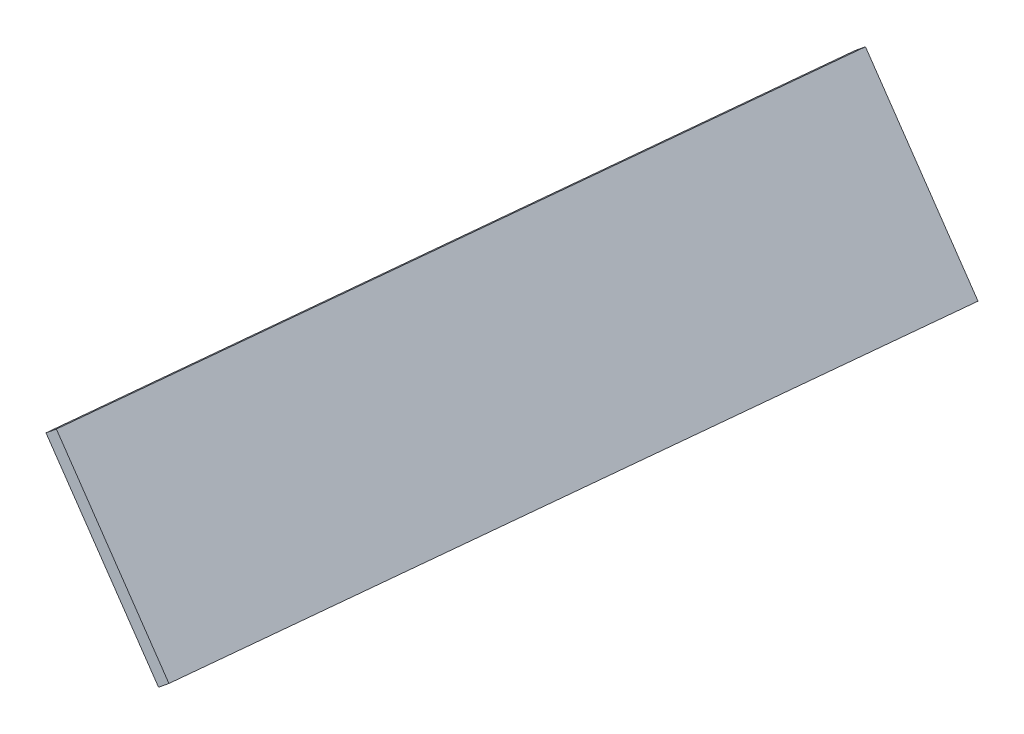
ISO-10303-21;
HEADER;
FILE_DESCRIPTION(('STEP AP214'),'2;1');
FILE_NAME('part.step','',(''),(''),'','','');
FILE_SCHEMA(('AUTOMOTIVE_DESIGN { 1 0 10303 214 1 1 1 1 }'));
ENDSEC;
DATA;
#1=APPLICATION_CONTEXT('core data for automotive mechanical design processes');
#2=APPLICATION_PROTOCOL_DEFINITION('international standard','automotive_design',2000,#1);
#3=PRODUCT_CONTEXT('',#1,'mechanical');
#4=PRODUCT('Part','Part','',(#3));
#5=PRODUCT_RELATED_PRODUCT_CATEGORY('part','',(#4));
#6=PRODUCT_DEFINITION_FORMATION('','',#4);
#7=PRODUCT_DEFINITION_CONTEXT('part definition',#1,'design');
#8=PRODUCT_DEFINITION('design','',#6,#7);
#9=PRODUCT_DEFINITION_SHAPE('','',#8);
#10=(LENGTH_UNIT() NAMED_UNIT(*) SI_UNIT(.MILLI.,.METRE.));
#11=(NAMED_UNIT(*) PLANE_ANGLE_UNIT() SI_UNIT($,.RADIAN.));
#12=(NAMED_UNIT(*) SI_UNIT($,.STERADIAN.) SOLID_ANGLE_UNIT());
#13=UNCERTAINTY_MEASURE_WITH_UNIT(LENGTH_MEASURE(1.E-05),#10,'distance_accuracy_value','');
#14=(GEOMETRIC_REPRESENTATION_CONTEXT(3) GLOBAL_UNCERTAINTY_ASSIGNED_CONTEXT((#13)) GLOBAL_UNIT_ASSIGNED_CONTEXT((#10,
#11,#12)) REPRESENTATION_CONTEXT('',''));
#15=CARTESIAN_POINT('',(0.,0.,0.));
#16=DIRECTION('',(0.,0.,1.));
#17=DIRECTION('',(1.,0.,0.));
#18=AXIS2_PLACEMENT_3D('',#15,#16,#17);
#19=CARTESIAN_POINT('',(81.237091029792,1.27644548625863,57.4281173222703));
#20=DIRECTION('',(0.0993306453087384,0.,-0.995054482379005));
#21=DIRECTION('',(-0.995054482379005,0.,-0.0993306453087384));
#22=AXIS2_PLACEMENT_3D('',#19,#20,#21);
#23=PLANE('',#22);
#24=DIRECTION('',(0.635066401307049,-0.769851758556472,0.0633950769257459));
#25=VECTOR('',#24,1.);
#26=CARTESIAN_POINT('',(79.7050021435541,0.,57.2751775783314));
#27=LINE('',#26,#25);
#28=CARTESIAN_POINT('',(63.1059020561431,20.1220634038388,55.6181835619989));
#29=VERTEX_POINT('',#28);
#30=CARTESIAN_POINT('',(79.7050021435541,0.,57.2751775783314));
#31=VERTEX_POINT('',#30);
#32=EDGE_CURVE('E102',#29,#31,#27,.T.);
#33=ORIENTED_EDGE('',*,*,#32,.T.);
#34=DIRECTION('',(-0.766044443118977,-0.638222743129315,-0.0764698719694832));
#35=VECTOR('',#34,1.);
#36=CARTESIAN_POINT('',(81.237091029792,1.27644548625863,57.4281173222703));
#37=LINE('',#36,#35);
#38=CARTESIAN_POINT('',(81.237091029792,1.27644548625863,57.4281173222703));
#39=VERTEX_POINT('',#38);
#40=EDGE_CURVE('E11',#39,#31,#37,.T.);
#41=ORIENTED_EDGE('',*,*,#40,.F.);
#42=DIRECTION('',(0.635066401307049,-0.769851758556472,0.0633950769257459));
#43=VECTOR('',#42,1.);
#44=CARTESIAN_POINT('',(81.237091029792,1.27644548625863,57.4281173222703));
#45=LINE('',#44,#43);
#46=CARTESIAN_POINT('',(64.6379909423811,21.3985088900975,55.7711233059379));
#47=VERTEX_POINT('',#46);
#48=EDGE_CURVE('E90',#47,#39,#45,.T.);
#49=ORIENTED_EDGE('',*,*,#48,.F.);
#50=DIRECTION('',(-0.766044443118977,-0.638222743129315,-0.0764698719694832));
#51=VECTOR('',#50,1.);
#52=CARTESIAN_POINT('',(64.6379909423811,21.3985088900975,55.7711233059379));
#53=LINE('',#52,#51);
#54=EDGE_CURVE('E98',#47,#29,#53,.T.);
#55=ORIENTED_EDGE('',*,*,#54,.T.);
#56=EDGE_LOOP('',(#33,#41,#49,#55));
#57=FACE_BOUND('',#56,.T.);
#58=ADVANCED_FACE('F39',(#57),#23,.F.);
#59=CARTESIAN_POINT('',(81.237091029792,1.27644548625863,57.4281173222703));
#60=DIRECTION('',(-0.635066401307049,0.769851758556472,-0.0633950769257495));
#61=DIRECTION('',(-0.771403429563892,-0.636346406336254,0.));
#62=AXIS2_PLACEMENT_3D('',#59,#60,#61);
#63=PLANE('',#62);
#64=DIRECTION('',(0.0993306453087407,0.,-0.995054482379005));
#65=VECTOR('',#64,1.);
#66=CARTESIAN_POINT('',(79.7050021435541,0.,57.2751775783314));
#67=LINE('',#66,#65);
#68=CARTESIAN_POINT('',(89.4542598608768,0.,-40.3889678758455));
#69=VERTEX_POINT('',#68);
#70=EDGE_CURVE('E94',#31,#69,#67,.T.);
#71=ORIENTED_EDGE('',*,*,#70,.T.);
#72=DIRECTION('',(-0.766044443118977,-0.638222743129315,-0.0764698719694832));
#73=VECTOR('',#72,1.);
#74=CARTESIAN_POINT('',(90.9863487471148,1.27644548625863,-40.2360281319065));
#75=LINE('',#74,#73);
#76=CARTESIAN_POINT('',(90.9863487471148,1.27644548625863,-40.2360281319065));
#77=VERTEX_POINT('',#76);
#78=EDGE_CURVE('E47',#77,#69,#75,.T.);
#79=ORIENTED_EDGE('',*,*,#78,.F.);
#80=DIRECTION('',(0.0993306453087407,0.,-0.995054482379005));
#81=VECTOR('',#80,1.);
#82=CARTESIAN_POINT('',(81.237091029792,1.27644548625863,57.4281173222703));
#83=LINE('',#82,#81);
#84=EDGE_CURVE('E85',#39,#77,#83,.T.);
#85=ORIENTED_EDGE('',*,*,#84,.F.);
#86=ORIENTED_EDGE('',*,*,#40,.T.);
#87=EDGE_LOOP('',(#71,#79,#85,#86));
#88=FACE_BOUND('',#87,.T.);
#89=ADVANCED_FACE('F93',(#88),#63,.F.);
#90=CARTESIAN_POINT('',(90.9863487471148,1.27644548625863,-40.2360281319065));
#91=DIRECTION('',(-0.0993306453087426,0.,0.995054482379005));
#92=DIRECTION('',(0.995054482379005,0.,0.0993306453087426));
#93=AXIS2_PLACEMENT_3D('',#90,#91,#92);
#94=PLANE('',#93);
#95=DIRECTION('',(-0.635066401307049,0.769851758556472,-0.0633950769257525));
#96=VECTOR('',#95,1.);
#97=CARTESIAN_POINT('',(89.4542598608768,0.,-40.3889678758455));
#98=LINE('',#97,#96);
#99=CARTESIAN_POINT('',(72.8551597734658,20.1220634038388,-42.0459618921781));
#100=VERTEX_POINT('',#99);
#101=EDGE_CURVE('E72',#69,#100,#98,.T.);
#102=ORIENTED_EDGE('',*,*,#101,.T.);
#103=DIRECTION('',(-0.766044443118977,-0.638222743129315,-0.0764698719694832));
#104=VECTOR('',#103,1.);
#105=CARTESIAN_POINT('',(74.3872486597038,21.3985088900975,-41.8930221482391));
#106=LINE('',#105,#104);
#107=CARTESIAN_POINT('',(74.3872486597038,21.3985088900975,-41.8930221482391));
#108=VERTEX_POINT('',#107);
#109=EDGE_CURVE('E95',#108,#100,#106,.T.);
#110=ORIENTED_EDGE('',*,*,#109,.F.);
#111=DIRECTION('',(-0.635066401307049,0.769851758556472,-0.0633950769257525));
#112=VECTOR('',#111,1.);
#113=CARTESIAN_POINT('',(90.9863487471148,1.27644548625863,-40.2360281319065));
#114=LINE('',#113,#112);
#115=EDGE_CURVE('E88',#77,#108,#114,.T.);
#116=ORIENTED_EDGE('',*,*,#115,.F.);
#117=ORIENTED_EDGE('',*,*,#78,.T.);
#118=EDGE_LOOP('',(#102,#110,#116,#117));
#119=FACE_BOUND('',#118,.T.);
#120=ADVANCED_FACE('F96',(#119),#94,.F.);
#121=CARTESIAN_POINT('',(64.6379909423811,21.3985088900975,55.7711233059379));
#122=DIRECTION('',(0.635066401307049,-0.769851758556472,0.0633950769257495));
#123=DIRECTION('',(0.771403429563892,0.636346406336254,0.));
#124=AXIS2_PLACEMENT_3D('',#121,#122,#123);
#125=PLANE('',#124);
#126=DIRECTION('',(-0.0993306453087407,0.,0.995054482379005));
#127=VECTOR('',#126,1.);
#128=CARTESIAN_POINT('',(63.1059020561431,20.1220634038388,55.6181835619989));
#129=LINE('',#128,#127);
#130=EDGE_CURVE('E78',#100,#29,#129,.T.);
#131=ORIENTED_EDGE('',*,*,#130,.T.);
#132=ORIENTED_EDGE('',*,*,#54,.F.);
#133=DIRECTION('',(-0.0993306453087407,0.,0.995054482379005));
#134=VECTOR('',#133,1.);
#135=CARTESIAN_POINT('',(64.6379909423811,21.3985088900975,55.7711233059379));
#136=LINE('',#135,#134);
#137=EDGE_CURVE('E55',#108,#47,#136,.T.);
#138=ORIENTED_EDGE('',*,*,#137,.F.);
#139=ORIENTED_EDGE('',*,*,#109,.T.);
#140=EDGE_LOOP('',(#131,#132,#138,#139));
#141=FACE_BOUND('',#140,.T.);
#142=ADVANCED_FACE('F109',(#141),#125,.F.);
#143=CARTESIAN_POINT('',(51.6600451279803,43.0400820839099,5.15692930398403));
#144=DIRECTION('',(-0.766044443118977,-0.638222743129315,-0.0764698719694831));
#145=DIRECTION('',(0.640097016045275,-0.768294090859701,0.));
#146=AXIS2_PLACEMENT_3D('',#143,#144,#145);
#147=PLANE('',#146);
#148=ORIENTED_EDGE('',*,*,#48,.T.);
#149=ORIENTED_EDGE('',*,*,#84,.T.);
#150=ORIENTED_EDGE('',*,*,#115,.T.);
#151=ORIENTED_EDGE('',*,*,#137,.T.);
#152=EDGE_LOOP('',(#148,#149,#150,#151));
#153=FACE_BOUND('',#152,.T.);
#154=ADVANCED_FACE('F86',(#153),#147,.F.);
#155=CARTESIAN_POINT('',(50.1279562417424,41.7636365976513,5.00398956004506));
#156=DIRECTION('',(-0.766044443118977,-0.638222743129315,-0.0764698719694831));
#157=DIRECTION('',(0.640097016045275,-0.768294090859701,0.));
#158=AXIS2_PLACEMENT_3D('',#155,#156,#157);
#159=PLANE('',#158);
#160=ORIENTED_EDGE('',*,*,#32,.F.);
#161=ORIENTED_EDGE('',*,*,#130,.F.);
#162=ORIENTED_EDGE('',*,*,#101,.F.);
#163=ORIENTED_EDGE('',*,*,#70,.F.);
#164=EDGE_LOOP('',(#160,#161,#162,#163));
#165=FACE_BOUND('',#164,.T.);
#166=ADVANCED_FACE('F112',(#165),#159,.T.);
#167=CLOSED_SHELL('',(#58,#89,#120,#142,#154,#166));
#168=MANIFOLD_SOLID_BREP('B2',#167);
#169=ADVANCED_BREP_SHAPE_REPRESENTATION('',(#18,#168),#14);
#170=SHAPE_DEFINITION_REPRESENTATION(#9,#169);
ENDSEC;
END-ISO-10303-21;
